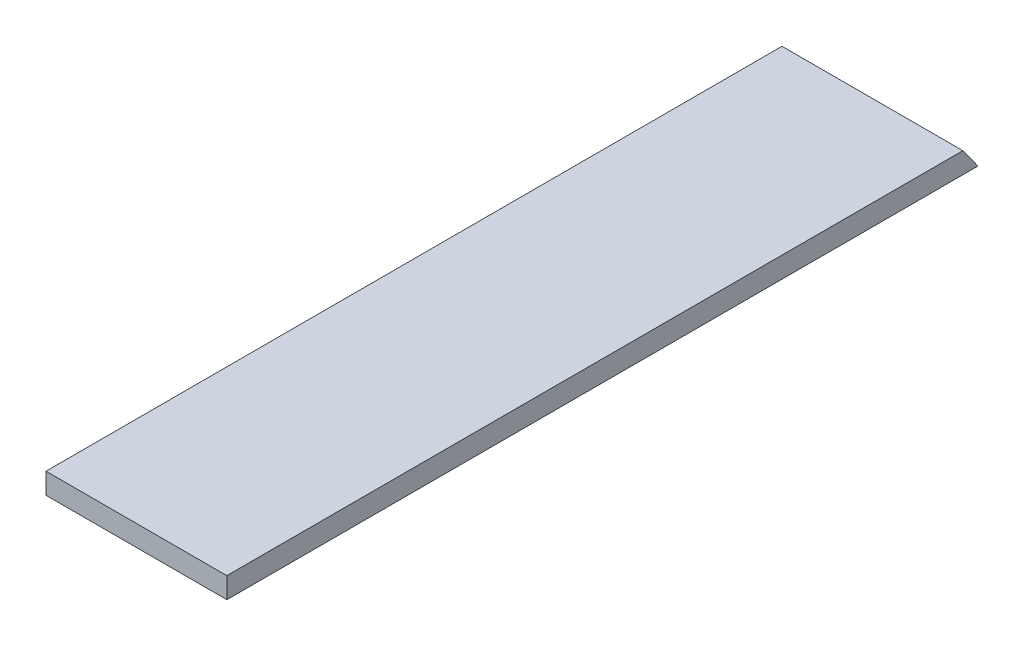
ISO-10303-21;
HEADER;
FILE_DESCRIPTION(('STEP AP214'),'2;1');
FILE_NAME('part.step','',(''),(''),'','','');
FILE_SCHEMA(('AUTOMOTIVE_DESIGN { 1 0 10303 214 1 1 1 1 }'));
ENDSEC;
DATA;
#1=APPLICATION_CONTEXT('core data for automotive mechanical design processes');
#2=APPLICATION_PROTOCOL_DEFINITION('international standard','automotive_design',2000,#1);
#3=PRODUCT_CONTEXT('',#1,'mechanical');
#4=PRODUCT('Part','Part','',(#3));
#5=PRODUCT_RELATED_PRODUCT_CATEGORY('part','',(#4));
#6=PRODUCT_DEFINITION_FORMATION('','',#4);
#7=PRODUCT_DEFINITION_CONTEXT('part definition',#1,'design');
#8=PRODUCT_DEFINITION('design','',#6,#7);
#9=PRODUCT_DEFINITION_SHAPE('','',#8);
#10=(LENGTH_UNIT() NAMED_UNIT(*) SI_UNIT(.MILLI.,.METRE.));
#11=(NAMED_UNIT(*) PLANE_ANGLE_UNIT() SI_UNIT($,.RADIAN.));
#12=(NAMED_UNIT(*) SI_UNIT($,.STERADIAN.) SOLID_ANGLE_UNIT());
#13=UNCERTAINTY_MEASURE_WITH_UNIT(LENGTH_MEASURE(1.E-05),#10,'distance_accuracy_value','');
#14=(GEOMETRIC_REPRESENTATION_CONTEXT(3) GLOBAL_UNCERTAINTY_ASSIGNED_CONTEXT((#13)) GLOBAL_UNIT_ASSIGNED_CONTEXT((#10,
#11,#12)) REPRESENTATION_CONTEXT('',''));
#15=CARTESIAN_POINT('',(0.,0.,0.));
#16=DIRECTION('',(0.,0.,1.));
#17=DIRECTION('',(1.,0.,0.));
#18=AXIS2_PLACEMENT_3D('',#15,#16,#17);
#19=CARTESIAN_POINT('',(26.,2.99999999999999,-51.820372415984));
#20=DIRECTION('',(0.,-0.587785252292467,0.809016994374952));
#21=DIRECTION('',(0.,-0.809016994374952,-0.587785252292467));
#22=AXIS2_PLACEMENT_3D('',#19,#20,#21);
#23=PLANE('',#22);
#24=DIRECTION('',(0.,0.809016994374952,0.587785252292467));
#25=VECTOR('',#24,1.);
#26=CARTESIAN_POINT('',(0.,2.99999999999999,-51.820372415984));
#27=LINE('',#26,#25);
#28=CARTESIAN_POINT('',(0.,0.,-54.));
#29=VERTEX_POINT('',#28);
#30=CARTESIAN_POINT('',(0.,2.99999999999999,-51.820372415984));
#31=VERTEX_POINT('',#30);
#32=EDGE_CURVE('E98',#29,#31,#27,.T.);
#33=ORIENTED_EDGE('',*,*,#32,.T.);
#34=DIRECTION('',(-1.,0.,0.));
#35=VECTOR('',#34,1.);
#36=CARTESIAN_POINT('',(26.,2.99999999999999,-51.820372415984));
#37=LINE('',#36,#35);
#38=CARTESIAN_POINT('',(26.,2.99999999999999,-51.820372415984));
#39=VERTEX_POINT('',#38);
#40=EDGE_CURVE('E11',#39,#31,#37,.T.);
#41=ORIENTED_EDGE('',*,*,#40,.F.);
#42=DIRECTION('',(0.,0.809016994374952,0.587785252292467));
#43=VECTOR('',#42,1.);
#44=CARTESIAN_POINT('',(26.,2.99999999999999,-51.820372415984));
#45=LINE('',#44,#43);
#46=CARTESIAN_POINT('',(26.,0.,-54.));
#47=VERTEX_POINT('',#46);
#48=EDGE_CURVE('E86',#47,#39,#45,.T.);
#49=ORIENTED_EDGE('',*,*,#48,.F.);
#50=DIRECTION('',(-1.,0.,0.));
#51=VECTOR('',#50,1.);
#52=CARTESIAN_POINT('',(26.,0.,-54.));
#53=LINE('',#52,#51);
#54=EDGE_CURVE('E94',#47,#29,#53,.T.);
#55=ORIENTED_EDGE('',*,*,#54,.T.);
#56=EDGE_LOOP('',(#33,#41,#49,#55));
#57=FACE_BOUND('',#56,.T.);
#58=ADVANCED_FACE('F35',(#57),#23,.F.);
#59=CARTESIAN_POINT('',(26.,2.99999999999999,54.));
#60=DIRECTION('',(0.,-1.,0.));
#61=DIRECTION('',(0.,0.,-1.));
#62=AXIS2_PLACEMENT_3D('',#59,#60,#61);
#63=PLANE('',#62);
#64=DIRECTION('',(0.,0.,1.));
#65=VECTOR('',#64,1.);
#66=CARTESIAN_POINT('',(0.,2.99999999999999,54.));
#67=LINE('',#66,#65);
#68=CARTESIAN_POINT('',(0.,2.99999999999999,54.));
#69=VERTEX_POINT('',#68);
#70=EDGE_CURVE('E90',#31,#69,#67,.T.);
#71=ORIENTED_EDGE('',*,*,#70,.T.);
#72=DIRECTION('',(-1.,0.,0.));
#73=VECTOR('',#72,1.);
#74=CARTESIAN_POINT('',(26.,2.99999999999999,54.));
#75=LINE('',#74,#73);
#76=CARTESIAN_POINT('',(26.,2.99999999999999,54.));
#77=VERTEX_POINT('',#76);
#78=EDGE_CURVE('E43',#77,#69,#75,.T.);
#79=ORIENTED_EDGE('',*,*,#78,.F.);
#80=DIRECTION('',(0.,0.,1.));
#81=VECTOR('',#80,1.);
#82=CARTESIAN_POINT('',(26.,2.99999999999999,54.));
#83=LINE('',#82,#81);
#84=EDGE_CURVE('E81',#39,#77,#83,.T.);
#85=ORIENTED_EDGE('',*,*,#84,.F.);
#86=ORIENTED_EDGE('',*,*,#40,.T.);
#87=EDGE_LOOP('',(#71,#79,#85,#86));
#88=FACE_BOUND('',#87,.T.);
#89=ADVANCED_FACE('F89',(#88),#63,.F.);
#90=CARTESIAN_POINT('',(26.,0.,54.));
#91=DIRECTION('',(0.,0.,-1.));
#92=DIRECTION('',(-1.,0.,0.));
#93=AXIS2_PLACEMENT_3D('',#90,#91,#92);
#94=PLANE('',#93);
#95=DIRECTION('',(0.,-1.,0.));
#96=VECTOR('',#95,1.);
#97=CARTESIAN_POINT('',(0.,0.,54.));
#98=LINE('',#97,#96);
#99=CARTESIAN_POINT('',(0.,0.,54.));
#100=VERTEX_POINT('',#99);
#101=EDGE_CURVE('E68',#69,#100,#98,.T.);
#102=ORIENTED_EDGE('',*,*,#101,.T.);
#103=DIRECTION('',(-1.,0.,0.));
#104=VECTOR('',#103,1.);
#105=CARTESIAN_POINT('',(26.,0.,54.));
#106=LINE('',#105,#104);
#107=CARTESIAN_POINT('',(26.,0.,54.));
#108=VERTEX_POINT('',#107);
#109=EDGE_CURVE('E91',#108,#100,#106,.T.);
#110=ORIENTED_EDGE('',*,*,#109,.F.);
#111=DIRECTION('',(0.,-1.,0.));
#112=VECTOR('',#111,1.);
#113=CARTESIAN_POINT('',(26.,0.,54.));
#114=LINE('',#113,#112);
#115=EDGE_CURVE('E84',#77,#108,#114,.T.);
#116=ORIENTED_EDGE('',*,*,#115,.F.);
#117=ORIENTED_EDGE('',*,*,#78,.T.);
#118=EDGE_LOOP('',(#102,#110,#116,#117));
#119=FACE_BOUND('',#118,.T.);
#120=ADVANCED_FACE('F92',(#119),#94,.F.);
#121=CARTESIAN_POINT('',(26.,0.,-54.));
#122=DIRECTION('',(0.,1.,0.));
#123=DIRECTION('',(0.,0.,1.));
#124=AXIS2_PLACEMENT_3D('',#121,#122,#123);
#125=PLANE('',#124);
#126=DIRECTION('',(0.,0.,-1.));
#127=VECTOR('',#126,1.);
#128=CARTESIAN_POINT('',(0.,0.,-54.));
#129=LINE('',#128,#127);
#130=EDGE_CURVE('E74',#100,#29,#129,.T.);
#131=ORIENTED_EDGE('',*,*,#130,.T.);
#132=ORIENTED_EDGE('',*,*,#54,.F.);
#133=DIRECTION('',(0.,0.,-1.));
#134=VECTOR('',#133,1.);
#135=CARTESIAN_POINT('',(26.,0.,-54.));
#136=LINE('',#135,#134);
#137=EDGE_CURVE('E51',#108,#47,#136,.T.);
#138=ORIENTED_EDGE('',*,*,#137,.F.);
#139=ORIENTED_EDGE('',*,*,#109,.T.);
#140=EDGE_LOOP('',(#131,#132,#138,#139));
#141=FACE_BOUND('',#140,.T.);
#142=ADVANCED_FACE('F105',(#141),#125,.F.);
#143=CARTESIAN_POINT('',(26.,0.,0.));
#144=DIRECTION('',(-1.,0.,0.));
#145=DIRECTION('',(0.,0.,1.));
#146=AXIS2_PLACEMENT_3D('',#143,#144,#145);
#147=PLANE('',#146);
#148=ORIENTED_EDGE('',*,*,#48,.T.);
#149=ORIENTED_EDGE('',*,*,#84,.T.);
#150=ORIENTED_EDGE('',*,*,#115,.T.);
#151=ORIENTED_EDGE('',*,*,#137,.T.);
#152=EDGE_LOOP('',(#148,#149,#150,#151));
#153=FACE_BOUND('',#152,.T.);
#154=ADVANCED_FACE('F82',(#153),#147,.F.);
#155=CARTESIAN_POINT('',(0.,0.,0.));
#156=DIRECTION('',(-1.,0.,0.));
#157=DIRECTION('',(0.,0.,1.));
#158=AXIS2_PLACEMENT_3D('',#155,#156,#157);
#159=PLANE('',#158);
#160=ORIENTED_EDGE('',*,*,#32,.F.);
#161=ORIENTED_EDGE('',*,*,#130,.F.);
#162=ORIENTED_EDGE('',*,*,#101,.F.);
#163=ORIENTED_EDGE('',*,*,#70,.F.);
#164=EDGE_LOOP('',(#160,#161,#162,#163));
#165=FACE_BOUND('',#164,.T.);
#166=ADVANCED_FACE('F108',(#165),#159,.T.);
#167=CLOSED_SHELL('',(#58,#89,#120,#142,#154,#166));
#168=MANIFOLD_SOLID_BREP('B2',#167);
#169=ADVANCED_BREP_SHAPE_REPRESENTATION('',(#18,#168),#14);
#170=SHAPE_DEFINITION_REPRESENTATION(#9,#169);
ENDSEC;
END-ISO-10303-21;
